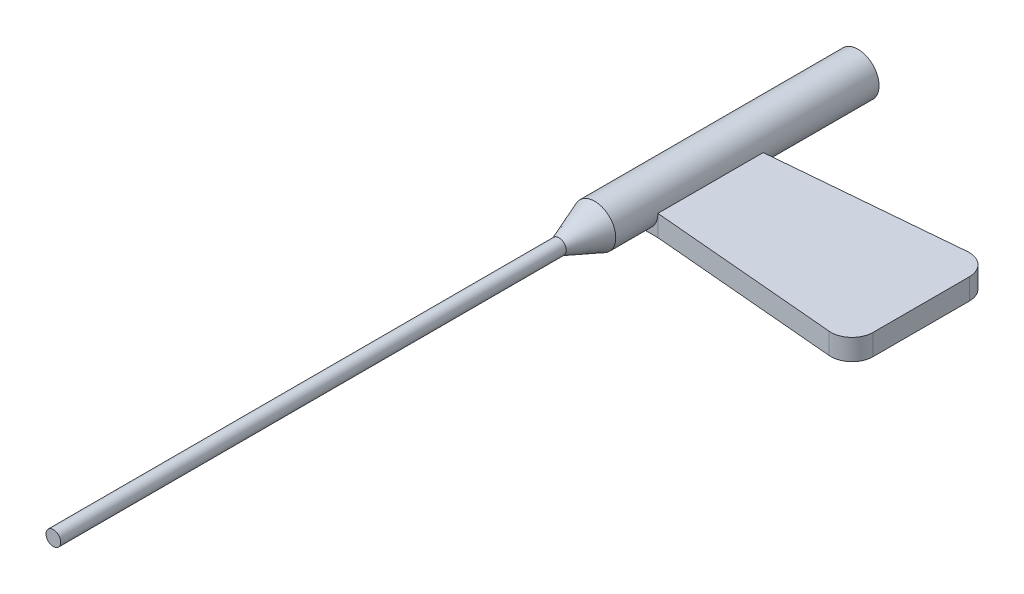
ISO-10303-21;
HEADER;
FILE_DESCRIPTION(('STEP AP214'),'2;1');
FILE_NAME('part.step','',(''),(''),'','','');
FILE_SCHEMA(('AUTOMOTIVE_DESIGN { 1 0 10303 214 1 1 1 1 }'));
ENDSEC;
DATA;
#1=APPLICATION_CONTEXT('core data for automotive mechanical design processes');
#2=APPLICATION_PROTOCOL_DEFINITION('international standard','automotive_design',2000,#1);
#3=PRODUCT_CONTEXT('',#1,'mechanical');
#4=PRODUCT('Part','Part','',(#3));
#5=PRODUCT_RELATED_PRODUCT_CATEGORY('part','',(#4));
#6=PRODUCT_DEFINITION_FORMATION('','',#4);
#7=PRODUCT_DEFINITION_CONTEXT('part definition',#1,'design');
#8=PRODUCT_DEFINITION('design','',#6,#7);
#9=PRODUCT_DEFINITION_SHAPE('','',#8);
#10=(LENGTH_UNIT() NAMED_UNIT(*) SI_UNIT(.MILLI.,.METRE.));
#11=(NAMED_UNIT(*) PLANE_ANGLE_UNIT() SI_UNIT($,.RADIAN.));
#12=(NAMED_UNIT(*) SI_UNIT($,.STERADIAN.) SOLID_ANGLE_UNIT());
#13=UNCERTAINTY_MEASURE_WITH_UNIT(LENGTH_MEASURE(1.E-05),#10,'distance_accuracy_value','');
#14=(GEOMETRIC_REPRESENTATION_CONTEXT(3) GLOBAL_UNCERTAINTY_ASSIGNED_CONTEXT((#13)) GLOBAL_UNIT_ASSIGNED_CONTEXT((#10,
#11,#12)) REPRESENTATION_CONTEXT('',''));
#15=CARTESIAN_POINT('',(0.,0.,0.));
#16=DIRECTION('',(0.,0.,1.));
#17=DIRECTION('',(1.,0.,0.));
#18=AXIS2_PLACEMENT_3D('',#15,#16,#17);
#19=CARTESIAN_POINT('',(0.,0.,12.5));
#20=DIRECTION('',(0.,0.,-1.));
#21=DIRECTION('',(-1.,0.,0.));
#22=AXIS2_PLACEMENT_3D('',#19,#20,#21);
#23=CYLINDRICAL_SURFACE('',#22,1.);
#24=CARTESIAN_POINT('',(0.,0.,0.));
#25=DIRECTION('',(0.,0.,1.));
#26=DIRECTION('',(1.,0.,0.));
#27=AXIS2_PLACEMENT_3D('',#24,#25,#26);
#28=CIRCLE('',#27,1.);
#29=CARTESIAN_POINT('',(1.,0.,0.));
#30=VERTEX_POINT('',#29);
#31=EDGE_CURVE('E122',#30,#30,#28,.T.);
#32=ORIENTED_EDGE('',*,*,#31,.T.);
#33=EDGE_LOOP('',(#32));
#34=FACE_BOUND('',#33,.T.);
#35=CARTESIAN_POINT('',(0.,0.,12.5));
#36=DIRECTION('',(0.,0.,1.));
#37=DIRECTION('',(1.,0.,0.));
#38=AXIS2_PLACEMENT_3D('',#35,#36,#37);
#39=CIRCLE('',#38,1.);
#40=CARTESIAN_POINT('',(1.,0.,12.5));
#41=VERTEX_POINT('',#40);
#42=EDGE_CURVE('E136',#41,#41,#39,.T.);
#43=ORIENTED_EDGE('',*,*,#42,.F.);
#44=EDGE_LOOP('',(#43));
#45=FACE_BOUND('',#44,.T.);
#46=DIRECTION('',(0.,0.,-1.));
#47=VECTOR('',#46,1.);
#48=CARTESIAN_POINT('',(0.,-1.,12.5));
#49=LINE('',#48,#47);
#50=CARTESIAN_POINT('',(0.,-1.,5.5));
#51=VERTEX_POINT('',#50);
#52=CARTESIAN_POINT('',(0.,-1.,10.5));
#53=VERTEX_POINT('',#52);
#54=EDGE_CURVE('E111',#51,#53,#49,.F.);
#55=ORIENTED_EDGE('',*,*,#54,.T.);
#56=CARTESIAN_POINT('',(0.,0.,10.5));
#57=DIRECTION('',(0.,0.,-1.));
#58=DIRECTION('',(-1.,0.,0.));
#59=AXIS2_PLACEMENT_3D('',#56,#57,#58);
#60=CIRCLE('',#59,1.);
#61=CARTESIAN_POINT('',(1.,0.,10.5));
#62=VERTEX_POINT('',#61);
#63=EDGE_CURVE('E131',#53,#62,#60,.F.);
#64=ORIENTED_EDGE('',*,*,#63,.T.);
#65=DIRECTION('',(0.,0.,-1.));
#66=VECTOR('',#65,1.);
#67=CARTESIAN_POINT('',(1.,0.,10.5));
#68=LINE('',#67,#66);
#69=CARTESIAN_POINT('',(1.,0.,5.5));
#70=VERTEX_POINT('',#69);
#71=EDGE_CURVE('E103',#62,#70,#68,.T.);
#72=ORIENTED_EDGE('',*,*,#71,.T.);
#73=CARTESIAN_POINT('',(0.,0.,5.5));
#74=DIRECTION('',(0.,0.,1.));
#75=DIRECTION('',(1.,0.,0.));
#76=AXIS2_PLACEMENT_3D('',#73,#74,#75);
#77=CIRCLE('',#76,1.);
#78=EDGE_CURVE('E117',#70,#51,#77,.F.);
#79=ORIENTED_EDGE('',*,*,#78,.T.);
#80=EDGE_LOOP('',(#55,#64,#72,#79));
#81=FACE_BOUND('',#80,.T.);
#82=ADVANCED_FACE('F36',(#34,#45,#81),#23,.T.);
#83=CARTESIAN_POINT('',(0.,0.,0.));
#84=DIRECTION('',(0.,0.,1.));
#85=DIRECTION('',(1.,0.,0.));
#86=AXIS2_PLACEMENT_3D('',#83,#84,#85);
#87=PLANE('',#86);
#88=ORIENTED_EDGE('',*,*,#31,.F.);
#89=EDGE_LOOP('',(#88));
#90=FACE_BOUND('',#89,.T.);
#91=ADVANCED_FACE('F194',(#90),#87,.F.);
#92=CARTESIAN_POINT('',(-1.002,-1.,10.5));
#93=DIRECTION('',(0.,0.,-1.));
#94=DIRECTION('',(-1.,0.,0.));
#95=AXIS2_PLACEMENT_3D('',#92,#93,#94);
#96=PLANE('',#95);
#97=ORIENTED_EDGE('',*,*,#63,.F.);
#98=DIRECTION('',(1.,0.,0.));
#99=VECTOR('',#98,1.);
#100=CARTESIAN_POINT('',(-1.002,-1.,10.5));
#101=LINE('',#100,#99);
#102=CARTESIAN_POINT('',(1.,-1.,10.5));
#103=VERTEX_POINT('',#102);
#104=EDGE_CURVE('E114',#53,#103,#101,.T.);
#105=ORIENTED_EDGE('',*,*,#104,.T.);
#106=DIRECTION('',(0.,1.,0.));
#107=VECTOR('',#106,1.);
#108=CARTESIAN_POINT('',(1.,-1.,10.5));
#109=LINE('',#108,#107);
#110=EDGE_CURVE('E119',#103,#62,#109,.T.);
#111=ORIENTED_EDGE('',*,*,#110,.T.);
#112=EDGE_LOOP('',(#97,#105,#111));
#113=FACE_BOUND('',#112,.T.);
#114=ADVANCED_FACE('F198',(#113),#96,.F.);
#115=CARTESIAN_POINT('',(-1.002,0.,5.5));
#116=DIRECTION('',(0.,0.,1.));
#117=DIRECTION('',(1.,0.,0.));
#118=AXIS2_PLACEMENT_3D('',#115,#116,#117);
#119=PLANE('',#118);
#120=ORIENTED_EDGE('',*,*,#78,.F.);
#121=DIRECTION('',(0.,-1.,0.));
#122=VECTOR('',#121,1.);
#123=CARTESIAN_POINT('',(1.,0.,5.5));
#124=LINE('',#123,#122);
#125=CARTESIAN_POINT('',(1.,-1.,5.5));
#126=VERTEX_POINT('',#125);
#127=EDGE_CURVE('E100',#70,#126,#124,.T.);
#128=ORIENTED_EDGE('',*,*,#127,.T.);
#129=DIRECTION('',(1.,0.,0.));
#130=VECTOR('',#129,1.);
#131=CARTESIAN_POINT('',(-1.002,-1.,5.5));
#132=LINE('',#131,#130);
#133=EDGE_CURVE('E107',#51,#126,#132,.T.);
#134=ORIENTED_EDGE('',*,*,#133,.F.);
#135=EDGE_LOOP('',(#120,#128,#134));
#136=FACE_BOUND('',#135,.T.);
#137=ADVANCED_FACE('F116',(#136),#119,.F.);
#138=CARTESIAN_POINT('',(-1.002,-1.,5.5));
#139=DIRECTION('',(0.,1.,0.));
#140=DIRECTION('',(0.,0.,1.));
#141=AXIS2_PLACEMENT_3D('',#138,#139,#140);
#142=PLANE('',#141);
#143=DIRECTION('',(-0.996194698091745,0.,0.0871557427476618));
#144=VECTOR('',#143,1.);
#145=CARTESIAN_POINT('',(11.,-1.,4.62511336474072));
#146=LINE('',#145,#144);
#147=CARTESIAN_POINT('',(9.91284425725234,-1.,4.72022716771825));
#148=VERTEX_POINT('',#147);
#149=EDGE_CURVE('E96',#148,#126,#146,.T.);
#150=ORIENTED_EDGE('',*,*,#149,.F.);
#151=CARTESIAN_POINT('',(10.,-1.,5.71642186581));
#152=DIRECTION('',(0.,1.,0.));
#153=DIRECTION('',(0.,0.,1.));
#154=AXIS2_PLACEMENT_3D('',#151,#152,#153);
#155=CIRCLE('',#154,1.);
#156=CARTESIAN_POINT('',(11.,-1.,5.71642186581));
#157=VERTEX_POINT('',#156);
#158=EDGE_CURVE('E44',#148,#157,#155,.F.);
#159=ORIENTED_EDGE('',*,*,#158,.T.);
#160=DIRECTION('',(0.,0.,-1.));
#161=VECTOR('',#160,1.);
#162=CARTESIAN_POINT('',(11.,-1.,11.3748866352593));
#163=LINE('',#162,#161);
#164=CARTESIAN_POINT('',(11.,-1.,10.28357813419));
#165=VERTEX_POINT('',#164);
#166=EDGE_CURVE('E104',#165,#157,#163,.T.);
#167=ORIENTED_EDGE('',*,*,#166,.F.);
#168=CARTESIAN_POINT('',(10.,-1.,10.28357813419));
#169=DIRECTION('',(0.,1.,0.));
#170=DIRECTION('',(0.,0.,1.));
#171=AXIS2_PLACEMENT_3D('',#168,#169,#170);
#172=CIRCLE('',#171,1.);
#173=CARTESIAN_POINT('',(9.91284425725234,-1.,11.2797728322817));
#174=VERTEX_POINT('',#173);
#175=EDGE_CURVE('E51',#165,#174,#172,.F.);
#176=ORIENTED_EDGE('',*,*,#175,.T.);
#177=DIRECTION('',(0.996194698091745,0.,0.0871557427476617));
#178=VECTOR('',#177,1.);
#179=CARTESIAN_POINT('',(1.,-1.,10.5));
#180=LINE('',#179,#178);
#181=EDGE_CURVE('E159',#103,#174,#180,.T.);
#182=ORIENTED_EDGE('',*,*,#181,.F.);
#183=ORIENTED_EDGE('',*,*,#104,.F.);
#184=ORIENTED_EDGE('',*,*,#54,.F.);
#185=ORIENTED_EDGE('',*,*,#133,.T.);
#186=EDGE_LOOP('',(#150,#159,#167,#176,#182,#183,#184,#185));
#187=FACE_BOUND('',#186,.T.);
#188=ADVANCED_FACE('F108',(#187),#142,.F.);
#189=CARTESIAN_POINT('',(1.,-1.,10.5));
#190=DIRECTION('',(-0.0871557427476617,0.,0.996194698091745));
#191=DIRECTION('',(0.996194698091745,0.,0.0871557427476617));
#192=AXIS2_PLACEMENT_3D('',#189,#190,#191);
#193=PLANE('',#192);
#194=ORIENTED_EDGE('',*,*,#181,.T.);
#195=DIRECTION('',(0.,1.,0.));
#196=VECTOR('',#195,1.);
#197=CARTESIAN_POINT('',(9.91284425725234,-1.,11.2797728322817));
#198=LINE('',#197,#196);
#199=CARTESIAN_POINT('',(9.91284425725234,0.,11.2797728322817));
#200=VERTEX_POINT('',#199);
#201=EDGE_CURVE('E11',#174,#200,#198,.T.);
#202=ORIENTED_EDGE('',*,*,#201,.T.);
#203=DIRECTION('',(0.996194698091745,0.,0.0871557427476617));
#204=VECTOR('',#203,1.);
#205=CARTESIAN_POINT('',(1.,0.,10.5));
#206=LINE('',#205,#204);
#207=EDGE_CURVE('E167',#62,#200,#206,.T.);
#208=ORIENTED_EDGE('',*,*,#207,.F.);
#209=ORIENTED_EDGE('',*,*,#110,.F.);
#210=EDGE_LOOP('',(#194,#202,#208,#209));
#211=FACE_BOUND('',#210,.T.);
#212=ADVANCED_FACE('F200',(#211),#193,.T.);
#213=CARTESIAN_POINT('',(11.,-1.,4.62511336474072));
#214=DIRECTION('',(-0.0871557427476618,0.,-0.996194698091745));
#215=DIRECTION('',(-0.996194698091745,0.,0.0871557427476618));
#216=AXIS2_PLACEMENT_3D('',#213,#214,#215);
#217=PLANE('',#216);
#218=DIRECTION('',(-0.996194698091745,0.,0.0871557427476618));
#219=VECTOR('',#218,1.);
#220=CARTESIAN_POINT('',(11.,0.,4.62511336474072));
#221=LINE('',#220,#219);
#222=CARTESIAN_POINT('',(9.91284425725234,0.,4.72022716771825));
#223=VERTEX_POINT('',#222);
#224=EDGE_CURVE('E125',#223,#70,#221,.T.);
#225=ORIENTED_EDGE('',*,*,#224,.F.);
#226=DIRECTION('',(0.,1.,0.));
#227=VECTOR('',#226,1.);
#228=CARTESIAN_POINT('',(9.91284425725234,-1.,4.72022716771825));
#229=LINE('',#228,#227);
#230=EDGE_CURVE('E59',#223,#148,#229,.F.);
#231=ORIENTED_EDGE('',*,*,#230,.T.);
#232=ORIENTED_EDGE('',*,*,#149,.T.);
#233=ORIENTED_EDGE('',*,*,#127,.F.);
#234=EDGE_LOOP('',(#225,#231,#232,#233));
#235=FACE_BOUND('',#234,.T.);
#236=ADVANCED_FACE('F98',(#235),#217,.T.);
#237=CARTESIAN_POINT('',(11.,-1.,11.3748866352593));
#238=DIRECTION('',(1.,0.,0.));
#239=DIRECTION('',(0.,0.,-1.));
#240=AXIS2_PLACEMENT_3D('',#237,#238,#239);
#241=PLANE('',#240);
#242=ORIENTED_EDGE('',*,*,#166,.T.);
#243=DIRECTION('',(0.,1.,0.));
#244=VECTOR('',#243,1.);
#245=CARTESIAN_POINT('',(11.,-1.,5.71642186581));
#246=LINE('',#245,#244);
#247=CARTESIAN_POINT('',(11.,0.,5.71642186581));
#248=VERTEX_POINT('',#247);
#249=EDGE_CURVE('E143',#157,#248,#246,.T.);
#250=ORIENTED_EDGE('',*,*,#249,.T.);
#251=DIRECTION('',(0.,0.,-1.));
#252=VECTOR('',#251,1.);
#253=CARTESIAN_POINT('',(11.,0.,11.3748866352593));
#254=LINE('',#253,#252);
#255=CARTESIAN_POINT('',(11.,0.,10.28357813419));
#256=VERTEX_POINT('',#255);
#257=EDGE_CURVE('E165',#256,#248,#254,.T.);
#258=ORIENTED_EDGE('',*,*,#257,.F.);
#259=DIRECTION('',(0.,1.,0.));
#260=VECTOR('',#259,1.);
#261=CARTESIAN_POINT('',(11.,-1.,10.28357813419));
#262=LINE('',#261,#260);
#263=EDGE_CURVE('E139',#256,#165,#262,.F.);
#264=ORIENTED_EDGE('',*,*,#263,.T.);
#265=EDGE_LOOP('',(#242,#250,#258,#264));
#266=FACE_BOUND('',#265,.T.);
#267=ADVANCED_FACE('F155',(#266),#241,.T.);
#268=CARTESIAN_POINT('',(0.,0.,0.));
#269=DIRECTION('',(0.,1.,0.));
#270=DIRECTION('',(0.,0.,1.));
#271=AXIS2_PLACEMENT_3D('',#268,#269,#270);
#272=PLANE('',#271);
#273=ORIENTED_EDGE('',*,*,#257,.T.);
#274=CARTESIAN_POINT('',(10.,0.,5.71642186581));
#275=DIRECTION('',(0.,1.,0.));
#276=DIRECTION('',(0.,0.,1.));
#277=AXIS2_PLACEMENT_3D('',#274,#275,#276);
#278=CIRCLE('',#277,1.);
#279=EDGE_CURVE('E148',#248,#223,#278,.T.);
#280=ORIENTED_EDGE('',*,*,#279,.T.);
#281=ORIENTED_EDGE('',*,*,#224,.T.);
#282=ORIENTED_EDGE('',*,*,#71,.F.);
#283=ORIENTED_EDGE('',*,*,#207,.T.);
#284=CARTESIAN_POINT('',(10.,0.,10.28357813419));
#285=DIRECTION('',(0.,1.,0.));
#286=DIRECTION('',(0.,0.,1.));
#287=AXIS2_PLACEMENT_3D('',#284,#285,#286);
#288=CIRCLE('',#287,1.);
#289=EDGE_CURVE('E146',#200,#256,#288,.T.);
#290=ORIENTED_EDGE('',*,*,#289,.T.);
#291=EDGE_LOOP('',(#273,#280,#281,#282,#283,#290));
#292=FACE_BOUND('',#291,.T.);
#293=ADVANCED_FACE('F163',(#292),#272,.T.);
#294=CARTESIAN_POINT('',(0.,0.,12.5));
#295=DIRECTION('',(0.,0.,-1.));
#296=DIRECTION('',(-1.,0.,0.));
#297=AXIS2_PLACEMENT_3D('',#294,#295,#296);
#298=CONICAL_SURFACE('',#297,1.,0.365201449788173);
#299=CARTESIAN_POINT('',(0.,0.,14.2));
#300=DIRECTION('',(0.,0.,1.));
#301=DIRECTION('',(1.,0.,0.));
#302=AXIS2_PLACEMENT_3D('',#299,#300,#301);
#303=CIRCLE('',#302,0.35);
#304=CARTESIAN_POINT('',(0.35,0.,14.2));
#305=VERTEX_POINT('',#304);
#306=EDGE_CURVE('E169',#305,#305,#303,.T.);
#307=ORIENTED_EDGE('',*,*,#306,.F.);
#308=EDGE_LOOP('',(#307));
#309=FACE_BOUND('',#308,.T.);
#310=ORIENTED_EDGE('',*,*,#42,.T.);
#311=EDGE_LOOP('',(#310));
#312=FACE_BOUND('',#311,.T.);
#313=ADVANCED_FACE('F183',(#309,#312),#298,.T.);
#314=CARTESIAN_POINT('',(0.,0.,38.2));
#315=DIRECTION('',(0.,0.,1.));
#316=DIRECTION('',(1.,0.,0.));
#317=AXIS2_PLACEMENT_3D('',#314,#315,#316);
#318=CYLINDRICAL_SURFACE('',#317,0.349999999999999);
#319=CARTESIAN_POINT('',(0.,0.,38.2));
#320=DIRECTION('',(0.,0.,1.));
#321=DIRECTION('',(1.,0.,0.));
#322=AXIS2_PLACEMENT_3D('',#319,#320,#321);
#323=CIRCLE('',#322,0.349999999999997);
#324=CARTESIAN_POINT('',(0.349999999999997,0.,38.2));
#325=VERTEX_POINT('',#324);
#326=EDGE_CURVE('E174',#325,#325,#323,.T.);
#327=ORIENTED_EDGE('',*,*,#326,.F.);
#328=EDGE_LOOP('',(#327));
#329=FACE_BOUND('',#328,.T.);
#330=ORIENTED_EDGE('',*,*,#306,.T.);
#331=EDGE_LOOP('',(#330));
#332=FACE_BOUND('',#331,.T.);
#333=ADVANCED_FACE('F180',(#329,#332),#318,.T.);
#334=CARTESIAN_POINT('',(-0.349999999999997,0.,38.2));
#335=DIRECTION('',(0.,0.,-1.));
#336=DIRECTION('',(-1.,0.,0.));
#337=AXIS2_PLACEMENT_3D('',#334,#335,#336);
#338=PLANE('',#337);
#339=ORIENTED_EDGE('',*,*,#326,.T.);
#340=EDGE_LOOP('',(#339));
#341=FACE_BOUND('',#340,.T.);
#342=ADVANCED_FACE('F178',(#341),#338,.F.);
#343=CARTESIAN_POINT('',(10.,-1.,5.71642186581));
#344=DIRECTION('',(0.,1.,0.));
#345=DIRECTION('',(0.,0.,1.));
#346=AXIS2_PLACEMENT_3D('',#343,#344,#345);
#347=CYLINDRICAL_SURFACE('',#346,1.);
#348=ORIENTED_EDGE('',*,*,#158,.F.);
#349=ORIENTED_EDGE('',*,*,#230,.F.);
#350=ORIENTED_EDGE('',*,*,#279,.F.);
#351=ORIENTED_EDGE('',*,*,#249,.F.);
#352=EDGE_LOOP('',(#348,#349,#350,#351));
#353=FACE_BOUND('',#352,.T.);
#354=ADVANCED_FACE('F161',(#353),#347,.T.);
#355=CARTESIAN_POINT('',(10.,-1.,10.28357813419));
#356=DIRECTION('',(0.,1.,0.));
#357=DIRECTION('',(0.,0.,1.));
#358=AXIS2_PLACEMENT_3D('',#355,#356,#357);
#359=CYLINDRICAL_SURFACE('',#358,1.);
#360=ORIENTED_EDGE('',*,*,#175,.F.);
#361=ORIENTED_EDGE('',*,*,#263,.F.);
#362=ORIENTED_EDGE('',*,*,#289,.F.);
#363=ORIENTED_EDGE('',*,*,#201,.F.);
#364=EDGE_LOOP('',(#360,#361,#362,#363));
#365=FACE_BOUND('',#364,.T.);
#366=ADVANCED_FACE('F38',(#365),#359,.T.);
#367=CLOSED_SHELL('',(#82,#91,#114,#137,#188,#212,#236,#267,#293,#313,#333,#342,#354,#366));
#368=MANIFOLD_SOLID_BREP('B2',#367);
#369=ADVANCED_BREP_SHAPE_REPRESENTATION('',(#18,#368),#14);
#370=SHAPE_DEFINITION_REPRESENTATION(#9,#369);
ENDSEC;
END-ISO-10303-21;
